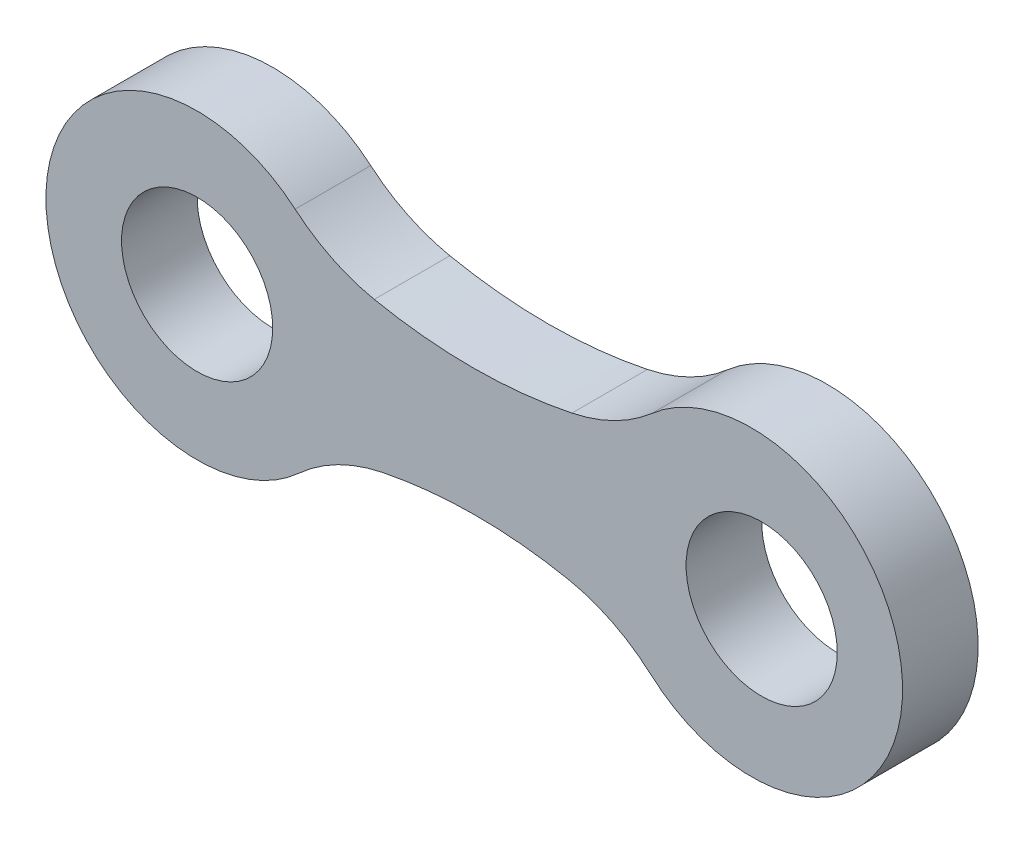
ISO-10303-21;
HEADER;
FILE_DESCRIPTION(('STEP AP214'),'2;1');
FILE_NAME('part.step','',(''),(''),'','','');
FILE_SCHEMA(('AUTOMOTIVE_DESIGN { 1 0 10303 214 1 1 1 1 }'));
ENDSEC;
DATA;
#1=APPLICATION_CONTEXT('core data for automotive mechanical design processes');
#2=APPLICATION_PROTOCOL_DEFINITION('international standard','automotive_design',2000,#1);
#3=PRODUCT_CONTEXT('',#1,'mechanical');
#4=PRODUCT('Part','Part','',(#3));
#5=PRODUCT_RELATED_PRODUCT_CATEGORY('part','',(#4));
#6=PRODUCT_DEFINITION_FORMATION('','',#4);
#7=PRODUCT_DEFINITION_CONTEXT('part definition',#1,'design');
#8=PRODUCT_DEFINITION('design','',#6,#7);
#9=PRODUCT_DEFINITION_SHAPE('','',#8);
#10=(LENGTH_UNIT() NAMED_UNIT(*) SI_UNIT(.MILLI.,.METRE.));
#11=(NAMED_UNIT(*) PLANE_ANGLE_UNIT() SI_UNIT($,.RADIAN.));
#12=(NAMED_UNIT(*) SI_UNIT($,.STERADIAN.) SOLID_ANGLE_UNIT());
#13=UNCERTAINTY_MEASURE_WITH_UNIT(LENGTH_MEASURE(1.E-05),#10,'distance_accuracy_value','');
#14=(GEOMETRIC_REPRESENTATION_CONTEXT(3) GLOBAL_UNCERTAINTY_ASSIGNED_CONTEXT((#13)) GLOBAL_UNIT_ASSIGNED_CONTEXT((#10,
#11,#12)) REPRESENTATION_CONTEXT('',''));
#15=CARTESIAN_POINT('',(0.,0.,0.));
#16=DIRECTION('',(0.,0.,1.));
#17=DIRECTION('',(1.,0.,0.));
#18=AXIS2_PLACEMENT_3D('',#15,#16,#17);
#19=CARTESIAN_POINT('',(-43.6476156140965,5.06918740873598,3.));
#20=DIRECTION('',(0.,0.,-1.));
#21=DIRECTION('',(-1.,0.,0.));
#22=AXIS2_PLACEMENT_3D('',#19,#20,#21);
#23=CYLINDRICAL_SURFACE('',#22,7.00000000000001);
#24=CARTESIAN_POINT('',(-43.6476156140965,5.06918740873598,0.));
#25=DIRECTION('',(0.,0.,-1.));
#26=DIRECTION('',(-1.,0.,0.));
#27=AXIS2_PLACEMENT_3D('',#24,#25,#26);
#28=CIRCLE('',#27,7.00000000000001);
#29=CARTESIAN_POINT('',(-42.287798819472,11.9358385783424,0.));
#30=VERTEX_POINT('',#29);
#31=CARTESIAN_POINT('',(-38.9930726384824,10.2974978134616,0.));
#32=VERTEX_POINT('',#31);
#33=EDGE_CURVE('E129',#30,#32,#28,.T.);
#34=ORIENTED_EDGE('',*,*,#33,.T.);
#35=DIRECTION('',(0.,0.,-1.));
#36=VECTOR('',#35,1.);
#37=CARTESIAN_POINT('',(-38.9930726384824,10.2974978134616,3.));
#38=LINE('',#37,#36);
#39=CARTESIAN_POINT('',(-38.9930726384824,10.2974978134616,3.));
#40=VERTEX_POINT('',#39);
#41=EDGE_CURVE('E11',#40,#32,#38,.T.);
#42=ORIENTED_EDGE('',*,*,#41,.F.);
#43=CARTESIAN_POINT('',(-43.6476156140965,5.06918740873598,3.));
#44=DIRECTION('',(0.,0.,-1.));
#45=DIRECTION('',(-1.,0.,0.));
#46=AXIS2_PLACEMENT_3D('',#43,#44,#45);
#47=CIRCLE('',#46,7.00000000000001);
#48=CARTESIAN_POINT('',(-42.287798819472,11.9358385783424,3.));
#49=VERTEX_POINT('',#48);
#50=EDGE_CURVE('E144',#49,#40,#47,.T.);
#51=ORIENTED_EDGE('',*,*,#50,.F.);
#52=DIRECTION('',(0.,0.,-1.));
#53=VECTOR('',#52,1.);
#54=CARTESIAN_POINT('',(-42.287798819472,11.9358385783424,3.));
#55=LINE('',#54,#53);
#56=EDGE_CURVE('E125',#49,#30,#55,.T.);
#57=ORIENTED_EDGE('',*,*,#56,.T.);
#58=EDGE_LOOP('',(#34,#42,#51,#57));
#59=FACE_BOUND('',#58,.T.);
#60=ADVANCED_FACE('F33',(#59),#23,.F.);
#61=CARTESIAN_POINT('',(-35.0034643736703,14.7789067317978,3.));
#62=DIRECTION('',(0.,0.,-1.));
#63=DIRECTION('',(-1.,0.,0.));
#64=AXIS2_PLACEMENT_3D('',#61,#62,#63);
#65=CYLINDRICAL_SURFACE('',#64,6.00000000000002);
#66=CARTESIAN_POINT('',(-35.0034643736703,14.7789067317978,0.));
#67=DIRECTION('',(0.,0.,1.));
#68=DIRECTION('',(1.,0.,0.));
#69=AXIS2_PLACEMENT_3D('',#66,#67,#68);
#70=CIRCLE('',#69,6.00000000000002);
#71=CARTESIAN_POINT('',(-38.9488672394255,19.2992824050014,0.));
#72=VERTEX_POINT('',#71);
#73=EDGE_CURVE('E132',#32,#72,#70,.T.);
#74=ORIENTED_EDGE('',*,*,#73,.T.);
#75=DIRECTION('',(0.,0.,-1.));
#76=VECTOR('',#75,1.);
#77=CARTESIAN_POINT('',(-38.9488672394255,19.2992824050014,3.));
#78=LINE('',#77,#76);
#79=CARTESIAN_POINT('',(-38.9488672394255,19.2992824050014,3.));
#80=VERTEX_POINT('',#79);
#81=EDGE_CURVE('E41',#80,#72,#78,.T.);
#82=ORIENTED_EDGE('',*,*,#81,.F.);
#83=CARTESIAN_POINT('',(-35.0034643736703,14.7789067317978,3.));
#84=DIRECTION('',(0.,0.,1.));
#85=DIRECTION('',(1.,0.,0.));
#86=AXIS2_PLACEMENT_3D('',#83,#84,#85);
#87=CIRCLE('',#86,6.00000000000002);
#88=EDGE_CURVE('E92',#40,#80,#87,.T.);
#89=ORIENTED_EDGE('',*,*,#88,.F.);
#90=ORIENTED_EDGE('',*,*,#41,.T.);
#91=EDGE_LOOP('',(#74,#82,#89,#90));
#92=FACE_BOUND('',#91,.T.);
#93=ADVANCED_FACE('F213',(#92),#65,.T.);
#94=CARTESIAN_POINT('',(-43.5518372494733,24.5730540237389,3.));
#95=DIRECTION('',(0.,0.,-1.));
#96=DIRECTION('',(-1.,0.,0.));
#97=AXIS2_PLACEMENT_3D('',#94,#95,#96);
#98=CYLINDRICAL_SURFACE('',#97,7.00000000000001);
#99=CARTESIAN_POINT('',(-43.5518372494733,24.5730540237389,0.));
#100=DIRECTION('',(0.,0.,-1.));
#101=DIRECTION('',(1.,0.,0.));
#102=AXIS2_PLACEMENT_3D('',#99,#100,#101);
#103=CIRCLE('',#102,7.00000000000001);
#104=CARTESIAN_POINT('',(-42.1276473443627,17.7194649556534,0.));
#105=VERTEX_POINT('',#104);
#106=EDGE_CURVE('E135',#72,#105,#103,.T.);
#107=ORIENTED_EDGE('',*,*,#106,.T.);
#108=DIRECTION('',(0.,0.,-1.));
#109=VECTOR('',#108,1.);
#110=CARTESIAN_POINT('',(-42.1276473443627,17.7194649556534,3.));
#111=LINE('',#110,#109);
#112=CARTESIAN_POINT('',(-42.1276473443627,17.7194649556534,3.));
#113=VERTEX_POINT('',#112);
#114=EDGE_CURVE('E151',#113,#105,#111,.T.);
#115=ORIENTED_EDGE('',*,*,#114,.F.);
#116=CARTESIAN_POINT('',(-43.5518372494733,24.5730540237389,3.));
#117=DIRECTION('',(0.,0.,-1.));
#118=DIRECTION('',(1.,0.,0.));
#119=AXIS2_PLACEMENT_3D('',#116,#117,#118);
#120=CIRCLE('',#119,7.00000000000001);
#121=EDGE_CURVE('E159',#80,#113,#120,.T.);
#122=ORIENTED_EDGE('',*,*,#121,.F.);
#123=ORIENTED_EDGE('',*,*,#81,.T.);
#124=EDGE_LOOP('',(#107,#115,#122,#123));
#125=FACE_BOUND('',#124,.T.);
#126=ADVANCED_FACE('F157',(#125),#98,.F.);
#127=CARTESIAN_POINT('',(-46.0832123470792,36.7547192875636,3.));
#128=DIRECTION('',(0.,0.,-1.));
#129=DIRECTION('',(-1.,0.,0.));
#130=AXIS2_PLACEMENT_3D('',#127,#128,#129);
#131=CYLINDRICAL_SURFACE('',#130,19.4418981061835);
#132=CARTESIAN_POINT('',(-46.0832123470792,36.7547192875636,0.));
#133=DIRECTION('',(0.,0.,-1.));
#134=DIRECTION('',(1.,0.,0.));
#135=AXIS2_PLACEMENT_3D('',#132,#133,#134);
#136=CIRCLE('',#135,19.4418981061835);
#137=CARTESIAN_POINT('',(-49.9718699590402,17.7056840377626,0.));
#138=VERTEX_POINT('',#137);
#139=EDGE_CURVE('E137',#105,#138,#136,.T.);
#140=ORIENTED_EDGE('',*,*,#139,.T.);
#141=DIRECTION('',(0.,0.,-1.));
#142=VECTOR('',#141,1.);
#143=CARTESIAN_POINT('',(-49.9718699590402,17.7056840377626,3.));
#144=LINE('',#143,#142);
#145=CARTESIAN_POINT('',(-49.9718699590402,17.7056840377626,3.));
#146=VERTEX_POINT('',#145);
#147=EDGE_CURVE('E148',#146,#138,#144,.T.);
#148=ORIENTED_EDGE('',*,*,#147,.F.);
#149=CARTESIAN_POINT('',(-46.0832123470792,36.7547192875636,3.));
#150=DIRECTION('',(0.,0.,-1.));
#151=DIRECTION('',(1.,0.,0.));
#152=AXIS2_PLACEMENT_3D('',#149,#150,#151);
#153=CIRCLE('',#152,19.4418981061835);
#154=EDGE_CURVE('E171',#113,#146,#153,.T.);
#155=ORIENTED_EDGE('',*,*,#154,.F.);
#156=ORIENTED_EDGE('',*,*,#114,.T.);
#157=EDGE_LOOP('',(#140,#148,#155,#156));
#158=FACE_BOUND('',#157,.T.);
#159=ADVANCED_FACE('F167',(#158),#131,.F.);
#160=CARTESIAN_POINT('',(-48.5717698692723,24.5642348860564,3.));
#161=DIRECTION('',(0.,0.,-1.));
#162=DIRECTION('',(-1.,0.,0.));
#163=AXIS2_PLACEMENT_3D('',#160,#161,#162);
#164=CYLINDRICAL_SURFACE('',#163,7.00000000000001);
#165=CARTESIAN_POINT('',(-48.5717698692723,24.5642348860564,0.));
#166=DIRECTION('',(0.,0.,-1.));
#167=DIRECTION('',(-1.,0.,0.));
#168=AXIS2_PLACEMENT_3D('',#165,#166,#167);
#169=CIRCLE('',#168,7.00000000000001);
#170=CARTESIAN_POINT('',(-53.1119130639482,19.2362803280822,0.));
#171=VERTEX_POINT('',#170);
#172=EDGE_CURVE('E139',#138,#171,#169,.T.);
#173=ORIENTED_EDGE('',*,*,#172,.T.);
#174=DIRECTION('',(0.,0.,-1.));
#175=VECTOR('',#174,1.);
#176=CARTESIAN_POINT('',(-53.1119130639482,19.2362803280822,3.));
#177=LINE('',#176,#175);
#178=CARTESIAN_POINT('',(-53.1119130639482,19.2362803280822,3.));
#179=VERTEX_POINT('',#178);
#180=EDGE_CURVE('E120',#179,#171,#177,.T.);
#181=ORIENTED_EDGE('',*,*,#180,.F.);
#182=CARTESIAN_POINT('',(-48.5717698692723,24.5642348860564,3.));
#183=DIRECTION('',(0.,0.,-1.));
#184=DIRECTION('',(-1.,0.,0.));
#185=AXIS2_PLACEMENT_3D('',#182,#183,#184);
#186=CIRCLE('',#185,7.00000000000001);
#187=EDGE_CURVE('E111',#146,#179,#186,.T.);
#188=ORIENTED_EDGE('',*,*,#187,.F.);
#189=ORIENTED_EDGE('',*,*,#147,.T.);
#190=EDGE_LOOP('',(#173,#181,#188,#189));
#191=FACE_BOUND('',#190,.T.);
#192=ADVANCED_FACE('F170',(#191),#164,.F.);
#193=CARTESIAN_POINT('',(-57.0034643736703,14.6694621355329,3.));
#194=DIRECTION('',(0.,0.,-1.));
#195=DIRECTION('',(-1.,0.,0.));
#196=AXIS2_PLACEMENT_3D('',#193,#194,#195);
#197=CYLINDRICAL_SURFACE('',#196,6.00000000000002);
#198=CARTESIAN_POINT('',(-57.0034643736703,14.6694621355329,0.));
#199=DIRECTION('',(0.,0.,1.));
#200=DIRECTION('',(1.,0.,0.));
#201=AXIS2_PLACEMENT_3D('',#198,#199,#200);
#202=CIRCLE('',#201,6.00000000000002);
#203=CARTESIAN_POINT('',(-52.9616523051322,10.235078841024,0.));
#204=VERTEX_POINT('',#203);
#205=EDGE_CURVE('E119',#171,#204,#202,.T.);
#206=ORIENTED_EDGE('',*,*,#205,.T.);
#207=DIRECTION('',(0.,0.,-1.));
#208=VECTOR('',#207,1.);
#209=CARTESIAN_POINT('',(-52.9616523051322,10.235078841024,3.));
#210=LINE('',#209,#208);
#211=CARTESIAN_POINT('',(-52.9616523051322,10.235078841024,3.));
#212=VERTEX_POINT('',#211);
#213=EDGE_CURVE('E116',#212,#204,#210,.T.);
#214=ORIENTED_EDGE('',*,*,#213,.F.);
#215=CARTESIAN_POINT('',(-57.0034643736703,14.6694621355329,3.));
#216=DIRECTION('',(0.,0.,1.));
#217=DIRECTION('',(1.,0.,0.));
#218=AXIS2_PLACEMENT_3D('',#215,#216,#217);
#219=CIRCLE('',#218,6.00000000000002);
#220=EDGE_CURVE('E105',#179,#212,#219,.T.);
#221=ORIENTED_EDGE('',*,*,#220,.F.);
#222=ORIENTED_EDGE('',*,*,#180,.T.);
#223=EDGE_LOOP('',(#206,#214,#221,#222));
#224=FACE_BOUND('',#223,.T.);
#225=ADVANCED_FACE('F117',(#224),#197,.T.);
#226=CARTESIAN_POINT('',(-48.2462048918377,5.06163166409694,3.));
#227=DIRECTION('',(0.,0.,-1.));
#228=DIRECTION('',(-1.,0.,0.));
#229=AXIS2_PLACEMENT_3D('',#226,#227,#228);
#230=CYLINDRICAL_SURFACE('',#229,7.00000000000001);
#231=CARTESIAN_POINT('',(-48.2462048918377,5.06163166409694,0.));
#232=DIRECTION('',(0.,0.,-1.));
#233=DIRECTION('',(1.,0.,0.));
#234=AXIS2_PLACEMENT_3D('',#231,#232,#233);
#235=CIRCLE('',#234,7.00000000000001);
#236=CARTESIAN_POINT('',(-49.6285788830891,11.9237772577369,0.));
#237=VERTEX_POINT('',#236);
#238=EDGE_CURVE('E78',#204,#237,#235,.T.);
#239=ORIENTED_EDGE('',*,*,#238,.T.);
#240=DIRECTION('',(0.,0.,-1.));
#241=VECTOR('',#240,1.);
#242=CARTESIAN_POINT('',(-49.6285788830891,11.9237772577369,3.));
#243=LINE('',#242,#241);
#244=CARTESIAN_POINT('',(-49.6285788830891,11.9237772577369,3.));
#245=VERTEX_POINT('',#244);
#246=EDGE_CURVE('E121',#245,#237,#243,.T.);
#247=ORIENTED_EDGE('',*,*,#246,.F.);
#248=CARTESIAN_POINT('',(-48.2462048918377,5.06163166409694,3.));
#249=DIRECTION('',(0.,0.,-1.));
#250=DIRECTION('',(1.,0.,0.));
#251=AXIS2_PLACEMENT_3D('',#248,#249,#250);
#252=CIRCLE('',#251,7.00000000000001);
#253=EDGE_CURVE('E109',#212,#245,#252,.T.);
#254=ORIENTED_EDGE('',*,*,#253,.F.);
#255=ORIENTED_EDGE('',*,*,#213,.T.);
#256=EDGE_LOOP('',(#239,#247,#254,#255));
#257=FACE_BOUND('',#256,.T.);
#258=ADVANCED_FACE('F123',(#257),#230,.F.);
#259=CARTESIAN_POINT('',(-45.9279963095831,-6.44602466373662,3.));
#260=DIRECTION('',(0.,0.,-1.));
#261=DIRECTION('',(-1.,0.,0.));
#262=AXIS2_PLACEMENT_3D('',#259,#260,#261);
#263=CYLINDRICAL_SURFACE('',#262,18.7388349162243);
#264=CARTESIAN_POINT('',(-45.9279963095831,-6.44602466373662,0.));
#265=DIRECTION('',(0.,0.,-1.));
#266=DIRECTION('',(-1.,0.,0.));
#267=AXIS2_PLACEMENT_3D('',#264,#265,#266);
#268=CIRCLE('',#267,18.7388349162243);
#269=EDGE_CURVE('E84',#237,#30,#268,.T.);
#270=ORIENTED_EDGE('',*,*,#269,.T.);
#271=ORIENTED_EDGE('',*,*,#56,.F.);
#272=CARTESIAN_POINT('',(-45.9279963095831,-6.44602466373662,3.));
#273=DIRECTION('',(0.,0.,-1.));
#274=DIRECTION('',(-1.,0.,0.));
#275=AXIS2_PLACEMENT_3D('',#272,#273,#274);
#276=CIRCLE('',#275,18.7388349162243);
#277=EDGE_CURVE('E49',#245,#49,#276,.T.);
#278=ORIENTED_EDGE('',*,*,#277,.F.);
#279=ORIENTED_EDGE('',*,*,#246,.T.);
#280=EDGE_LOOP('',(#270,#271,#278,#279));
#281=FACE_BOUND('',#280,.T.);
#282=ADVANCED_FACE('F200',(#281),#263,.F.);
#283=CARTESIAN_POINT('',(-39.3255399938834,9.92404707026689,3.));
#284=DIRECTION('',(0.,0.,-1.));
#285=DIRECTION('',(-1.,0.,0.));
#286=AXIS2_PLACEMENT_3D('',#283,#284,#285);
#287=PLANE('',#286);
#288=CARTESIAN_POINT('',(-57.0019149877994,14.7045876418852,3.));
#289=DIRECTION('',(0.,0.,1.));
#290=DIRECTION('',(1.,0.,0.));
#291=AXIS2_PLACEMENT_3D('',#288,#289,#290);
#292=CIRCLE('',#291,3.);
#293=CARTESIAN_POINT('',(-54.0019149877994,14.7045876418852,3.));
#294=VERTEX_POINT('',#293);
#295=EDGE_CURVE('E183',#294,#294,#292,.T.);
#296=ORIENTED_EDGE('',*,*,#295,.F.);
#297=EDGE_LOOP('',(#296));
#298=FACE_BOUND('',#297,.T.);
#299=CARTESIAN_POINT('',(-34.5954840720865,14.7494426634659,3.));
#300=DIRECTION('',(0.,0.,1.));
#301=DIRECTION('',(1.,0.,0.));
#302=AXIS2_PLACEMENT_3D('',#299,#300,#301);
#303=CIRCLE('',#302,3.);
#304=CARTESIAN_POINT('',(-31.5954840720865,14.7494426634659,3.));
#305=VERTEX_POINT('',#304);
#306=EDGE_CURVE('E177',#305,#305,#303,.T.);
#307=ORIENTED_EDGE('',*,*,#306,.F.);
#308=EDGE_LOOP('',(#307));
#309=FACE_BOUND('',#308,.T.);
#310=ORIENTED_EDGE('',*,*,#50,.T.);
#311=ORIENTED_EDGE('',*,*,#88,.T.);
#312=ORIENTED_EDGE('',*,*,#121,.T.);
#313=ORIENTED_EDGE('',*,*,#154,.T.);
#314=ORIENTED_EDGE('',*,*,#187,.T.);
#315=ORIENTED_EDGE('',*,*,#220,.T.);
#316=ORIENTED_EDGE('',*,*,#253,.T.);
#317=ORIENTED_EDGE('',*,*,#277,.T.);
#318=EDGE_LOOP('',(#310,#311,#312,#313,#314,#315,#316,#317));
#319=FACE_BOUND('',#318,.T.);
#320=ADVANCED_FACE('F107',(#298,#309,#319),#287,.F.);
#321=CARTESIAN_POINT('',(-39.3255399938834,9.92404707026689,0.));
#322=DIRECTION('',(0.,0.,-1.));
#323=DIRECTION('',(-1.,0.,0.));
#324=AXIS2_PLACEMENT_3D('',#321,#322,#323);
#325=PLANE('',#324);
#326=CARTESIAN_POINT('',(-57.0019149877994,14.7045876418852,0.));
#327=DIRECTION('',(0.,0.,1.));
#328=DIRECTION('',(1.,0.,0.));
#329=AXIS2_PLACEMENT_3D('',#326,#327,#328);
#330=CIRCLE('',#329,3.);
#331=CARTESIAN_POINT('',(-54.0019149877994,14.7045876418852,0.));
#332=VERTEX_POINT('',#331);
#333=EDGE_CURVE('E133',#332,#332,#330,.T.);
#334=ORIENTED_EDGE('',*,*,#333,.T.);
#335=EDGE_LOOP('',(#334));
#336=FACE_BOUND('',#335,.T.);
#337=CARTESIAN_POINT('',(-34.5954840720865,14.7494426634659,0.));
#338=DIRECTION('',(0.,0.,1.));
#339=DIRECTION('',(1.,0.,0.));
#340=AXIS2_PLACEMENT_3D('',#337,#338,#339);
#341=CIRCLE('',#340,3.);
#342=CARTESIAN_POINT('',(-31.5954840720865,14.7494426634659,0.));
#343=VERTEX_POINT('',#342);
#344=EDGE_CURVE('E180',#343,#343,#341,.T.);
#345=ORIENTED_EDGE('',*,*,#344,.T.);
#346=EDGE_LOOP('',(#345));
#347=FACE_BOUND('',#346,.T.);
#348=ORIENTED_EDGE('',*,*,#33,.F.);
#349=ORIENTED_EDGE('',*,*,#269,.F.);
#350=ORIENTED_EDGE('',*,*,#238,.F.);
#351=ORIENTED_EDGE('',*,*,#205,.F.);
#352=ORIENTED_EDGE('',*,*,#172,.F.);
#353=ORIENTED_EDGE('',*,*,#139,.F.);
#354=ORIENTED_EDGE('',*,*,#106,.F.);
#355=ORIENTED_EDGE('',*,*,#73,.F.);
#356=EDGE_LOOP('',(#348,#349,#350,#351,#352,#353,#354,#355));
#357=FACE_BOUND('',#356,.T.);
#358=ADVANCED_FACE('F163',(#336,#347,#357),#325,.T.);
#359=CARTESIAN_POINT('',(-34.5954840720865,14.7494426634659,0.));
#360=DIRECTION('',(0.,0.,1.));
#361=DIRECTION('',(1.,0.,0.));
#362=AXIS2_PLACEMENT_3D('',#359,#360,#361);
#363=CYLINDRICAL_SURFACE('',#362,3.);
#364=ORIENTED_EDGE('',*,*,#344,.F.);
#365=EDGE_LOOP('',(#364));
#366=FACE_BOUND('',#365,.T.);
#367=ORIENTED_EDGE('',*,*,#306,.T.);
#368=EDGE_LOOP('',(#367));
#369=FACE_BOUND('',#368,.T.);
#370=ADVANCED_FACE('F194',(#366,#369),#363,.F.);
#371=CARTESIAN_POINT('',(-57.0019149877994,14.7045876418852,0.));
#372=DIRECTION('',(0.,0.,1.));
#373=DIRECTION('',(1.,0.,0.));
#374=AXIS2_PLACEMENT_3D('',#371,#372,#373);
#375=CYLINDRICAL_SURFACE('',#374,3.);
#376=ORIENTED_EDGE('',*,*,#333,.F.);
#377=EDGE_LOOP('',(#376));
#378=FACE_BOUND('',#377,.T.);
#379=ORIENTED_EDGE('',*,*,#295,.T.);
#380=EDGE_LOOP('',(#379));
#381=FACE_BOUND('',#380,.T.);
#382=ADVANCED_FACE('F191',(#378,#381),#375,.F.);
#383=CLOSED_SHELL('',(#60,#93,#126,#159,#192,#225,#258,#282,#320,#358,#370,#382));
#384=MANIFOLD_SOLID_BREP('B2',#383);
#385=ADVANCED_BREP_SHAPE_REPRESENTATION('',(#18,#384),#14);
#386=SHAPE_DEFINITION_REPRESENTATION(#9,#385);
ENDSEC;
END-ISO-10303-21;
